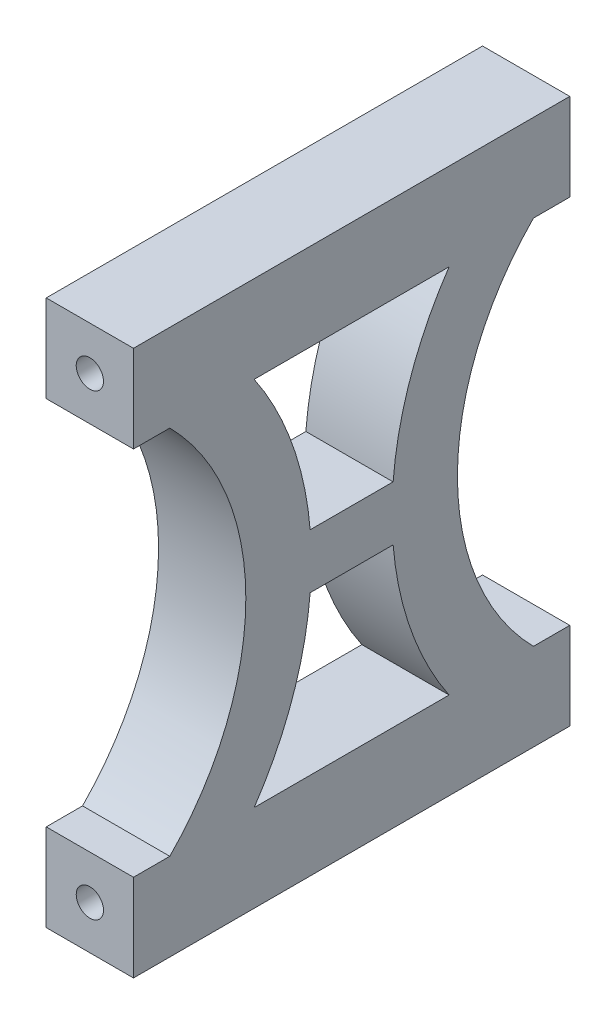
ISO-10303-21;
HEADER;
FILE_DESCRIPTION(('STEP AP214'),'2;1');
FILE_NAME('part.step','',(''),(''),'','','');
FILE_SCHEMA(('AUTOMOTIVE_DESIGN { 1 0 10303 214 1 1 1 1 }'));
ENDSEC;
DATA;
#1=APPLICATION_CONTEXT('core data for automotive mechanical design processes');
#2=APPLICATION_PROTOCOL_DEFINITION('international standard','automotive_design',2000,#1);
#3=PRODUCT_CONTEXT('',#1,'mechanical');
#4=PRODUCT('Part','Part','',(#3));
#5=PRODUCT_RELATED_PRODUCT_CATEGORY('part','',(#4));
#6=PRODUCT_DEFINITION_FORMATION('','',#4);
#7=PRODUCT_DEFINITION_CONTEXT('part definition',#1,'design');
#8=PRODUCT_DEFINITION('design','',#6,#7);
#9=PRODUCT_DEFINITION_SHAPE('','',#8);
#10=(LENGTH_UNIT() NAMED_UNIT(*) SI_UNIT(.MILLI.,.METRE.));
#11=(NAMED_UNIT(*) PLANE_ANGLE_UNIT() SI_UNIT($,.RADIAN.));
#12=(NAMED_UNIT(*) SI_UNIT($,.STERADIAN.) SOLID_ANGLE_UNIT());
#13=UNCERTAINTY_MEASURE_WITH_UNIT(LENGTH_MEASURE(1.E-05),#10,'distance_accuracy_value','');
#14=(GEOMETRIC_REPRESENTATION_CONTEXT(3) GLOBAL_UNCERTAINTY_ASSIGNED_CONTEXT((#13)) GLOBAL_UNIT_ASSIGNED_CONTEXT((#10,
#11,#12)) REPRESENTATION_CONTEXT('',''));
#15=CARTESIAN_POINT('',(0.,0.,0.));
#16=DIRECTION('',(0.,0.,1.));
#17=DIRECTION('',(1.,0.,0.));
#18=AXIS2_PLACEMENT_3D('',#15,#16,#17);
#19=CARTESIAN_POINT('',(-4.,17.,40.));
#20=DIRECTION('',(0.,1.,0.));
#21=DIRECTION('',(0.,0.,1.));
#22=AXIS2_PLACEMENT_3D('',#19,#20,#21);
#23=PLANE('',#22);
#24=DIRECTION('',(0.,0.,-1.));
#25=VECTOR('',#24,1.);
#26=CARTESIAN_POINT('',(4.,17.,40.));
#27=LINE('',#26,#25);
#28=CARTESIAN_POINT('',(4.,17.,3.32964050832425));
#29=VERTEX_POINT('',#28);
#30=CARTESIAN_POINT('',(4.,17.,0.));
#31=VERTEX_POINT('',#30);
#32=EDGE_CURVE('E292',#29,#31,#27,.T.);
#33=ORIENTED_EDGE('',*,*,#32,.F.);
#34=DIRECTION('',(-1.,0.,0.));
#35=VECTOR('',#34,1.);
#36=CARTESIAN_POINT('',(4.,17.,3.32964050832425));
#37=LINE('',#36,#35);
#38=CARTESIAN_POINT('',(-4.,17.,3.32964050832425));
#39=VERTEX_POINT('',#38);
#40=EDGE_CURVE('E249',#29,#39,#37,.T.);
#41=ORIENTED_EDGE('',*,*,#40,.T.);
#42=DIRECTION('',(0.,0.,-1.));
#43=VECTOR('',#42,1.);
#44=CARTESIAN_POINT('',(-4.,17.,40.));
#45=LINE('',#44,#43);
#46=CARTESIAN_POINT('',(-4.,17.,0.));
#47=VERTEX_POINT('',#46);
#48=EDGE_CURVE('E305',#39,#47,#45,.T.);
#49=ORIENTED_EDGE('',*,*,#48,.T.);
#50=DIRECTION('',(1.,0.,0.));
#51=VECTOR('',#50,1.);
#52=CARTESIAN_POINT('',(-4.,17.,0.));
#53=LINE('',#52,#51);
#54=EDGE_CURVE('E286',#47,#31,#53,.T.);
#55=ORIENTED_EDGE('',*,*,#54,.T.);
#56=EDGE_LOOP('',(#33,#41,#49,#55));
#57=FACE_BOUND('',#56,.T.);
#58=ADVANCED_FACE('F31',(#57),#23,.F.);
#59=CARTESIAN_POINT('',(-4.,17.,28.9360149786938));
#60=VERTEX_POINT('',#59);
#61=CARTESIAN_POINT('',(-4.,17.,11.0639850213062));
#62=VERTEX_POINT('',#61);
#63=EDGE_CURVE('E46',#60,#62,#45,.T.);
#64=ORIENTED_EDGE('',*,*,#63,.T.);
#65=DIRECTION('',(-1.,0.,0.));
#66=VECTOR('',#65,1.);
#67=CARTESIAN_POINT('',(4.,17.,11.0639850213062));
#68=LINE('',#67,#66);
#69=CARTESIAN_POINT('',(4.,17.,11.0639850213062));
#70=VERTEX_POINT('',#69);
#71=EDGE_CURVE('E253',#70,#62,#68,.T.);
#72=ORIENTED_EDGE('',*,*,#71,.F.);
#73=CARTESIAN_POINT('',(4.,17.,28.9360149786938));
#74=VERTEX_POINT('',#73);
#75=EDGE_CURVE('E306',#74,#70,#27,.T.);
#76=ORIENTED_EDGE('',*,*,#75,.F.);
#77=DIRECTION('',(-1.,0.,0.));
#78=VECTOR('',#77,1.);
#79=CARTESIAN_POINT('',(4.,17.,28.9360149786938));
#80=LINE('',#79,#78);
#81=EDGE_CURVE('E259',#74,#60,#80,.T.);
#82=ORIENTED_EDGE('',*,*,#81,.T.);
#83=EDGE_LOOP('',(#64,#72,#76,#82));
#84=FACE_BOUND('',#83,.T.);
#85=ADVANCED_FACE('F373',(#84),#23,.F.);
#86=CARTESIAN_POINT('',(4.,17.,40.));
#87=DIRECTION('',(0.,0.,1.));
#88=DIRECTION('',(1.,0.,0.));
#89=AXIS2_PLACEMENT_3D('',#86,#87,#88);
#90=PLANE('',#89);
#91=DIRECTION('',(0.,1.,0.));
#92=VECTOR('',#91,1.);
#93=CARTESIAN_POINT('',(4.,25.,40.));
#94=LINE('',#93,#92);
#95=CARTESIAN_POINT('',(4.,17.,40.));
#96=VERTEX_POINT('',#95);
#97=CARTESIAN_POINT('',(4.,25.,40.));
#98=VERTEX_POINT('',#97);
#99=EDGE_CURVE('E282',#96,#98,#94,.T.);
#100=ORIENTED_EDGE('',*,*,#99,.T.);
#101=DIRECTION('',(-1.,0.,0.));
#102=VECTOR('',#101,1.);
#103=CARTESIAN_POINT('',(-4.,25.,40.));
#104=LINE('',#103,#102);
#105=CARTESIAN_POINT('',(-4.,25.,40.));
#106=VERTEX_POINT('',#105);
#107=EDGE_CURVE('E285',#98,#106,#104,.T.);
#108=ORIENTED_EDGE('',*,*,#107,.T.);
#109=DIRECTION('',(0.,-1.,0.));
#110=VECTOR('',#109,1.);
#111=CARTESIAN_POINT('',(-4.,25.,40.));
#112=LINE('',#111,#110);
#113=CARTESIAN_POINT('',(-4.,17.,40.));
#114=VERTEX_POINT('',#113);
#115=EDGE_CURVE('E288',#106,#114,#112,.T.);
#116=ORIENTED_EDGE('',*,*,#115,.T.);
#117=DIRECTION('',(1.,0.,0.));
#118=VECTOR('',#117,1.);
#119=CARTESIAN_POINT('',(-4.,17.,40.));
#120=LINE('',#119,#118);
#121=EDGE_CURVE('E290',#114,#96,#120,.T.);
#122=ORIENTED_EDGE('',*,*,#121,.T.);
#123=EDGE_LOOP('',(#100,#108,#116,#122));
#124=FACE_BOUND('',#123,.T.);
#125=CARTESIAN_POINT('',(0.,21.,40.));
#126=DIRECTION('',(0.,0.,1.));
#127=DIRECTION('',(1.,0.,0.));
#128=AXIS2_PLACEMENT_3D('',#125,#126,#127);
#129=CIRCLE('',#128,1.25);
#130=CARTESIAN_POINT('',(1.25,21.,40.));
#131=VERTEX_POINT('',#130);
#132=EDGE_CURVE('E276',#131,#131,#129,.T.);
#133=ORIENTED_EDGE('',*,*,#132,.F.);
#134=EDGE_LOOP('',(#133));
#135=FACE_BOUND('',#134,.T.);
#136=ADVANCED_FACE('F354',(#124,#135),#90,.T.);
#137=CARTESIAN_POINT('',(4.,17.,0.));
#138=DIRECTION('',(0.,0.,1.));
#139=DIRECTION('',(1.,0.,0.));
#140=AXIS2_PLACEMENT_3D('',#137,#138,#139);
#141=PLANE('',#140);
#142=DIRECTION('',(0.,1.,0.));
#143=VECTOR('',#142,1.);
#144=CARTESIAN_POINT('',(4.,25.,0.));
#145=LINE('',#144,#143);
#146=CARTESIAN_POINT('',(4.,25.,0.));
#147=VERTEX_POINT('',#146);
#148=EDGE_CURVE('E279',#31,#147,#145,.T.);
#149=ORIENTED_EDGE('',*,*,#148,.F.);
#150=ORIENTED_EDGE('',*,*,#54,.F.);
#151=DIRECTION('',(0.,-1.,0.));
#152=VECTOR('',#151,1.);
#153=CARTESIAN_POINT('',(-4.,25.,0.));
#154=LINE('',#153,#152);
#155=CARTESIAN_POINT('',(-4.,25.,0.));
#156=VERTEX_POINT('',#155);
#157=EDGE_CURVE('E297',#156,#47,#154,.T.);
#158=ORIENTED_EDGE('',*,*,#157,.F.);
#159=DIRECTION('',(-1.,0.,0.));
#160=VECTOR('',#159,1.);
#161=CARTESIAN_POINT('',(-4.,25.,0.));
#162=LINE('',#161,#160);
#163=EDGE_CURVE('E295',#147,#156,#162,.T.);
#164=ORIENTED_EDGE('',*,*,#163,.F.);
#165=EDGE_LOOP('',(#149,#150,#158,#164));
#166=FACE_BOUND('',#165,.T.);
#167=CARTESIAN_POINT('',(0.,21.,0.));
#168=DIRECTION('',(0.,0.,1.));
#169=DIRECTION('',(1.,0.,0.));
#170=AXIS2_PLACEMENT_3D('',#167,#168,#169);
#171=CIRCLE('',#170,1.25);
#172=CARTESIAN_POINT('',(1.25,21.,0.));
#173=VERTEX_POINT('',#172);
#174=EDGE_CURVE('E252',#173,#173,#171,.T.);
#175=ORIENTED_EDGE('',*,*,#174,.T.);
#176=EDGE_LOOP('',(#175));
#177=FACE_BOUND('',#176,.T.);
#178=ADVANCED_FACE('F315',(#166,#177),#141,.F.);
#179=CARTESIAN_POINT('',(4.,25.,40.));
#180=DIRECTION('',(-1.,0.,0.));
#181=DIRECTION('',(0.,-1.,0.));
#182=AXIS2_PLACEMENT_3D('',#179,#180,#181);
#183=PLANE('',#182);
#184=CARTESIAN_POINT('',(4.,0.,53.9165540725057));
#185=DIRECTION('',(1.,0.,0.));
#186=DIRECTION('',(0.,-1.,0.));
#187=AXIS2_PLACEMENT_3D('',#184,#185,#186);
#188=CIRCLE('',#187,24.2163421581346);
#189=CARTESIAN_POINT('',(4.,-17.,36.6703594916758));
#190=VERTEX_POINT('',#189);
#191=CARTESIAN_POINT('',(4.,17.,36.6703594916758));
#192=VERTEX_POINT('',#191);
#193=EDGE_CURVE('E217',#190,#192,#188,.T.);
#194=ORIENTED_EDGE('',*,*,#193,.F.);
#195=DIRECTION('',(0.,0.,-1.));
#196=VECTOR('',#195,1.);
#197=CARTESIAN_POINT('',(4.,-17.,40.));
#198=LINE('',#197,#196);
#199=CARTESIAN_POINT('',(4.,-17.,40.));
#200=VERTEX_POINT('',#199);
#201=EDGE_CURVE('E201',#200,#190,#198,.T.);
#202=ORIENTED_EDGE('',*,*,#201,.F.);
#203=DIRECTION('',(0.,1.,0.));
#204=VECTOR('',#203,1.);
#205=CARTESIAN_POINT('',(4.,-25.,40.));
#206=LINE('',#205,#204);
#207=CARTESIAN_POINT('',(4.,-25.,40.));
#208=VERTEX_POINT('',#207);
#209=EDGE_CURVE('E179',#208,#200,#206,.T.);
#210=ORIENTED_EDGE('',*,*,#209,.F.);
#211=DIRECTION('',(0.,0.,-1.));
#212=VECTOR('',#211,1.);
#213=CARTESIAN_POINT('',(4.,-25.,40.));
#214=LINE('',#213,#212);
#215=CARTESIAN_POINT('',(4.,-25.,0.));
#216=VERTEX_POINT('',#215);
#217=EDGE_CURVE('E176',#208,#216,#214,.T.);
#218=ORIENTED_EDGE('',*,*,#217,.T.);
#219=DIRECTION('',(0.,1.,0.));
#220=VECTOR('',#219,1.);
#221=CARTESIAN_POINT('',(4.,-25.,0.));
#222=LINE('',#221,#220);
#223=CARTESIAN_POINT('',(4.,-17.,0.));
#224=VERTEX_POINT('',#223);
#225=EDGE_CURVE('E458',#216,#224,#222,.T.);
#226=ORIENTED_EDGE('',*,*,#225,.T.);
#227=CARTESIAN_POINT('',(4.00000000000001,-17.,3.32964050832425));
#228=VERTEX_POINT('',#227);
#229=EDGE_CURVE('E335',#228,#224,#198,.T.);
#230=ORIENTED_EDGE('',*,*,#229,.F.);
#231=CARTESIAN_POINT('',(4.,0.,-13.9165540725057));
#232=DIRECTION('',(1.,0.,0.));
#233=DIRECTION('',(0.,1.,0.));
#234=AXIS2_PLACEMENT_3D('',#231,#232,#233);
#235=CIRCLE('',#234,24.2163421581346);
#236=EDGE_CURVE('E205',#29,#228,#235,.T.);
#237=ORIENTED_EDGE('',*,*,#236,.F.);
#238=ORIENTED_EDGE('',*,*,#32,.T.);
#239=ORIENTED_EDGE('',*,*,#148,.T.);
#240=DIRECTION('',(0.,0.,-1.));
#241=VECTOR('',#240,1.);
#242=CARTESIAN_POINT('',(4.,25.,40.));
#243=LINE('',#242,#241);
#244=EDGE_CURVE('E11',#98,#147,#243,.T.);
#245=ORIENTED_EDGE('',*,*,#244,.F.);
#246=ORIENTED_EDGE('',*,*,#99,.F.);
#247=EDGE_CURVE('E302',#96,#192,#27,.T.);
#248=ORIENTED_EDGE('',*,*,#247,.T.);
#249=EDGE_LOOP('',(#194,#202,#210,#218,#226,#230,#237,#238,#239,#245,#246,#248));
#250=FACE_BOUND('',#249,.T.);
#251=CARTESIAN_POINT('',(4.,0.,53.9165540725057));
#252=DIRECTION('',(-1.,0.,0.));
#253=DIRECTION('',(0.,-1.,0.));
#254=AXIS2_PLACEMENT_3D('',#251,#252,#253);
#255=CIRCLE('',#254,30.2163421581346);
#256=CARTESIAN_POINT('',(4.,2.49108976294423,23.8030719555133));
#257=VERTEX_POINT('',#256);
#258=EDGE_CURVE('E220',#74,#257,#255,.T.);
#259=ORIENTED_EDGE('',*,*,#258,.F.);
#260=ORIENTED_EDGE('',*,*,#75,.T.);
#261=CARTESIAN_POINT('',(4.,0.,-13.9165540725057));
#262=DIRECTION('',(-1.,0.,0.));
#263=DIRECTION('',(0.,1.,0.));
#264=AXIS2_PLACEMENT_3D('',#261,#262,#263);
#265=CIRCLE('',#264,30.2163421581346);
#266=CARTESIAN_POINT('',(4.,2.49108976294424,16.1969280444867));
#267=VERTEX_POINT('',#266);
#268=EDGE_CURVE('E226',#267,#70,#265,.T.);
#269=ORIENTED_EDGE('',*,*,#268,.F.);
#270=DIRECTION('',(0.,0.,-1.));
#271=VECTOR('',#270,1.);
#272=CARTESIAN_POINT('',(4.,2.49108976294423,23.8030719555133));
#273=LINE('',#272,#271);
#274=EDGE_CURVE('E223',#257,#267,#273,.T.);
#275=ORIENTED_EDGE('',*,*,#274,.F.);
#276=EDGE_LOOP('',(#259,#260,#269,#275));
#277=FACE_BOUND('',#276,.T.);
#278=CARTESIAN_POINT('',(4.,-17.,28.9360149786938));
#279=VERTEX_POINT('',#278);
#280=CARTESIAN_POINT('',(4.,-17.,11.0639850213062));
#281=VERTEX_POINT('',#280);
#282=EDGE_CURVE('E337',#279,#281,#198,.T.);
#283=ORIENTED_EDGE('',*,*,#282,.F.);
#284=CARTESIAN_POINT('',(4.,0.,53.9165540725057));
#285=DIRECTION('',(-1.,0.,0.));
#286=DIRECTION('',(0.,-1.,0.));
#287=AXIS2_PLACEMENT_3D('',#284,#285,#286);
#288=CIRCLE('',#287,30.2163421581346);
#289=CARTESIAN_POINT('',(4.00000000000001,-2.50891023705574,23.8045514350214));
#290=VERTEX_POINT('',#289);
#291=EDGE_CURVE('E214',#290,#279,#288,.T.);
#292=ORIENTED_EDGE('',*,*,#291,.F.);
#293=DIRECTION('',(0.,0.,1.));
#294=VECTOR('',#293,1.);
#295=CARTESIAN_POINT('',(4.00000000000001,-2.50891023705577,23.8045514350214));
#296=LINE('',#295,#294);
#297=CARTESIAN_POINT('',(4.00000000000001,-2.50891023705577,16.1954485649786));
#298=VERTEX_POINT('',#297);
#299=EDGE_CURVE('E211',#298,#290,#296,.T.);
#300=ORIENTED_EDGE('',*,*,#299,.F.);
#301=CARTESIAN_POINT('',(4.,0.,-13.9165540725057));
#302=DIRECTION('',(-1.,0.,0.));
#303=DIRECTION('',(0.,1.,0.));
#304=AXIS2_PLACEMENT_3D('',#301,#302,#303);
#305=CIRCLE('',#304,30.2163421581346);
#306=EDGE_CURVE('E207',#281,#298,#305,.T.);
#307=ORIENTED_EDGE('',*,*,#306,.F.);
#308=EDGE_LOOP('',(#283,#292,#300,#307));
#309=FACE_BOUND('',#308,.T.);
#310=ADVANCED_FACE('F33',(#250,#277,#309),#183,.F.);
#311=CARTESIAN_POINT('',(-4.,25.,40.));
#312=DIRECTION('',(0.,-1.,0.));
#313=DIRECTION('',(0.,0.,-1.));
#314=AXIS2_PLACEMENT_3D('',#311,#312,#313);
#315=PLANE('',#314);
#316=ORIENTED_EDGE('',*,*,#163,.T.);
#317=DIRECTION('',(0.,0.,-1.));
#318=VECTOR('',#317,1.);
#319=CARTESIAN_POINT('',(-4.,25.,40.));
#320=LINE('',#319,#318);
#321=EDGE_CURVE('E39',#106,#156,#320,.T.);
#322=ORIENTED_EDGE('',*,*,#321,.F.);
#323=ORIENTED_EDGE('',*,*,#107,.F.);
#324=ORIENTED_EDGE('',*,*,#244,.T.);
#325=EDGE_LOOP('',(#316,#322,#323,#324));
#326=FACE_BOUND('',#325,.T.);
#327=ADVANCED_FACE('F356',(#326),#315,.F.);
#328=CARTESIAN_POINT('',(-4.,25.,40.));
#329=DIRECTION('',(1.,0.,0.));
#330=DIRECTION('',(0.,1.,0.));
#331=AXIS2_PLACEMENT_3D('',#328,#329,#330);
#332=PLANE('',#331);
#333=DIRECTION('',(0.,0.,-1.));
#334=VECTOR('',#333,1.);
#335=CARTESIAN_POINT('',(-4.,-17.,40.));
#336=LINE('',#335,#334);
#337=CARTESIAN_POINT('',(-4.,-17.,40.));
#338=VERTEX_POINT('',#337);
#339=CARTESIAN_POINT('',(-4.,-17.,36.6703594916758));
#340=VERTEX_POINT('',#339);
#341=EDGE_CURVE('E331',#338,#340,#336,.T.);
#342=ORIENTED_EDGE('',*,*,#341,.T.);
#343=CARTESIAN_POINT('',(-4.,0.,53.9165540725057));
#344=DIRECTION('',(1.,0.,0.));
#345=DIRECTION('',(0.,-1.,0.));
#346=AXIS2_PLACEMENT_3D('',#343,#344,#345);
#347=CIRCLE('',#346,24.2163421581346);
#348=CARTESIAN_POINT('',(-4.,17.,36.6703594916758));
#349=VERTEX_POINT('',#348);
#350=EDGE_CURVE('E238',#340,#349,#347,.T.);
#351=ORIENTED_EDGE('',*,*,#350,.T.);
#352=EDGE_CURVE('E54',#114,#349,#45,.T.);
#353=ORIENTED_EDGE('',*,*,#352,.F.);
#354=ORIENTED_EDGE('',*,*,#115,.F.);
#355=ORIENTED_EDGE('',*,*,#321,.T.);
#356=ORIENTED_EDGE('',*,*,#157,.T.);
#357=ORIENTED_EDGE('',*,*,#48,.F.);
#358=CARTESIAN_POINT('',(-4.,0.,-13.9165540725057));
#359=DIRECTION('',(1.,0.,0.));
#360=DIRECTION('',(0.,1.,0.));
#361=AXIS2_PLACEMENT_3D('',#358,#359,#360);
#362=CIRCLE('',#361,24.2163421581346);
#363=CARTESIAN_POINT('',(-3.99999999999999,-17.,3.32964050832425));
#364=VERTEX_POINT('',#363);
#365=EDGE_CURVE('E196',#39,#364,#362,.T.);
#366=ORIENTED_EDGE('',*,*,#365,.T.);
#367=CARTESIAN_POINT('',(-4.,-17.,0.));
#368=VERTEX_POINT('',#367);
#369=EDGE_CURVE('E321',#364,#368,#336,.T.);
#370=ORIENTED_EDGE('',*,*,#369,.T.);
#371=DIRECTION('',(0.,-1.,0.));
#372=VECTOR('',#371,1.);
#373=CARTESIAN_POINT('',(-4.,-25.,0.));
#374=LINE('',#373,#372);
#375=CARTESIAN_POINT('',(-4.,-25.,0.));
#376=VERTEX_POINT('',#375);
#377=EDGE_CURVE('E195',#368,#376,#374,.T.);
#378=ORIENTED_EDGE('',*,*,#377,.T.);
#379=DIRECTION('',(0.,0.,-1.));
#380=VECTOR('',#379,1.);
#381=CARTESIAN_POINT('',(-4.,-25.,40.));
#382=LINE('',#381,#380);
#383=CARTESIAN_POINT('',(-4.,-25.,40.));
#384=VERTEX_POINT('',#383);
#385=EDGE_CURVE('E173',#384,#376,#382,.T.);
#386=ORIENTED_EDGE('',*,*,#385,.F.);
#387=DIRECTION('',(0.,-1.,0.));
#388=VECTOR('',#387,1.);
#389=CARTESIAN_POINT('',(-4.,-25.,40.));
#390=LINE('',#389,#388);
#391=EDGE_CURVE('E180',#338,#384,#390,.T.);
#392=ORIENTED_EDGE('',*,*,#391,.F.);
#393=EDGE_LOOP('',(#342,#351,#353,#354,#355,#356,#357,#366,#370,#378,#386,#392));
#394=FACE_BOUND('',#393,.T.);
#395=ORIENTED_EDGE('',*,*,#63,.F.);
#396=CARTESIAN_POINT('',(-4.,0.,53.9165540725057));
#397=DIRECTION('',(-1.,0.,0.));
#398=DIRECTION('',(0.,-1.,0.));
#399=AXIS2_PLACEMENT_3D('',#396,#397,#398);
#400=CIRCLE('',#399,30.2163421581346);
#401=CARTESIAN_POINT('',(-4.,2.49108976294423,23.8030719555133));
#402=VERTEX_POINT('',#401);
#403=EDGE_CURVE('E241',#60,#402,#400,.T.);
#404=ORIENTED_EDGE('',*,*,#403,.T.);
#405=DIRECTION('',(0.,0.,-1.));
#406=VECTOR('',#405,1.);
#407=CARTESIAN_POINT('',(-4.,2.49108976294423,23.8030719555133));
#408=LINE('',#407,#406);
#409=CARTESIAN_POINT('',(-4.,2.49108976294423,16.1969280444867));
#410=VERTEX_POINT('',#409);
#411=EDGE_CURVE('E244',#402,#410,#408,.T.);
#412=ORIENTED_EDGE('',*,*,#411,.T.);
#413=CARTESIAN_POINT('',(-4.,0.,-13.9165540725057));
#414=DIRECTION('',(-1.,0.,0.));
#415=DIRECTION('',(0.,1.,0.));
#416=AXIS2_PLACEMENT_3D('',#413,#414,#415);
#417=CIRCLE('',#416,30.2163421581346);
#418=EDGE_CURVE('E208',#410,#62,#417,.T.);
#419=ORIENTED_EDGE('',*,*,#418,.T.);
#420=EDGE_LOOP('',(#395,#404,#412,#419));
#421=FACE_BOUND('',#420,.T.);
#422=CARTESIAN_POINT('',(-4.,0.,53.9165540725057));
#423=DIRECTION('',(-1.,0.,0.));
#424=DIRECTION('',(0.,-1.,0.));
#425=AXIS2_PLACEMENT_3D('',#422,#423,#424);
#426=CIRCLE('',#425,30.2163421581346);
#427=CARTESIAN_POINT('',(-3.99999999999999,-2.50891023705575,23.8045514350214));
#428=VERTEX_POINT('',#427);
#429=CARTESIAN_POINT('',(-3.99999999999999,-17.,28.9360149786938));
#430=VERTEX_POINT('',#429);
#431=EDGE_CURVE('E235',#428,#430,#426,.T.);
#432=ORIENTED_EDGE('',*,*,#431,.T.);
#433=CARTESIAN_POINT('',(-3.99999999999999,-17.,11.0639850213062));
#434=VERTEX_POINT('',#433);
#435=EDGE_CURVE('E329',#430,#434,#336,.T.);
#436=ORIENTED_EDGE('',*,*,#435,.T.);
#437=CARTESIAN_POINT('',(-4.,0.,-13.9165540725057));
#438=DIRECTION('',(-1.,0.,0.));
#439=DIRECTION('',(0.,1.,0.));
#440=AXIS2_PLACEMENT_3D('',#437,#438,#439);
#441=CIRCLE('',#440,30.2163421581346);
#442=CARTESIAN_POINT('',(-3.99999999999999,-2.50891023705577,16.1954485649786));
#443=VERTEX_POINT('',#442);
#444=EDGE_CURVE('E199',#434,#443,#441,.T.);
#445=ORIENTED_EDGE('',*,*,#444,.T.);
#446=DIRECTION('',(0.,0.,1.));
#447=VECTOR('',#446,1.);
#448=CARTESIAN_POINT('',(-3.99999999999999,-2.50891023705577,23.8045514350214));
#449=LINE('',#448,#447);
#450=EDGE_CURVE('E232',#443,#428,#449,.T.);
#451=ORIENTED_EDGE('',*,*,#450,.T.);
#452=EDGE_LOOP('',(#432,#436,#445,#451));
#453=FACE_BOUND('',#452,.T.);
#454=ADVANCED_FACE('F192',(#394,#421,#453),#332,.F.);
#455=ORIENTED_EDGE('',*,*,#352,.T.);
#456=DIRECTION('',(-1.,0.,0.));
#457=VECTOR('',#456,1.);
#458=CARTESIAN_POINT('',(4.,17.,36.6703594916757));
#459=LINE('',#458,#457);
#460=EDGE_CURVE('E261',#192,#349,#459,.T.);
#461=ORIENTED_EDGE('',*,*,#460,.F.);
#462=ORIENTED_EDGE('',*,*,#247,.F.);
#463=ORIENTED_EDGE('',*,*,#121,.F.);
#464=EDGE_LOOP('',(#455,#461,#462,#463));
#465=FACE_BOUND('',#464,.T.);
#466=ADVANCED_FACE('F352',(#465),#23,.F.);
#467=CARTESIAN_POINT('',(0.,21.,40.));
#468=DIRECTION('',(0.,0.,-1.));
#469=DIRECTION('',(-1.,0.,0.));
#470=AXIS2_PLACEMENT_3D('',#467,#468,#469);
#471=CYLINDRICAL_SURFACE('',#470,1.25);
#472=ORIENTED_EDGE('',*,*,#132,.T.);
#473=EDGE_LOOP('',(#472));
#474=FACE_BOUND('',#473,.T.);
#475=ORIENTED_EDGE('',*,*,#174,.F.);
#476=EDGE_LOOP('',(#475));
#477=FACE_BOUND('',#476,.T.);
#478=ADVANCED_FACE('F384',(#474,#477),#471,.F.);
#479=CARTESIAN_POINT('',(4.,0.,-13.9165540725057));
#480=DIRECTION('',(-1.,0.,0.));
#481=DIRECTION('',(0.,-1.,0.));
#482=AXIS2_PLACEMENT_3D('',#479,#480,#481);
#483=CYLINDRICAL_SURFACE('',#482,24.2163421581346);
#484=ORIENTED_EDGE('',*,*,#365,.F.);
#485=ORIENTED_EDGE('',*,*,#40,.F.);
#486=ORIENTED_EDGE('',*,*,#236,.T.);
#487=DIRECTION('',(-1.,0.,0.));
#488=VECTOR('',#487,1.);
#489=CARTESIAN_POINT('',(4.00000000000001,-17.,3.32964050832425));
#490=LINE('',#489,#488);
#491=EDGE_CURVE('E228',#228,#364,#490,.T.);
#492=ORIENTED_EDGE('',*,*,#491,.T.);
#493=EDGE_LOOP('',(#484,#485,#486,#492));
#494=FACE_BOUND('',#493,.T.);
#495=ADVANCED_FACE('F389',(#494),#483,.F.);
#496=CARTESIAN_POINT('',(4.,0.,-13.9165540725057));
#497=DIRECTION('',(-1.,0.,0.));
#498=DIRECTION('',(0.,-1.,0.));
#499=AXIS2_PLACEMENT_3D('',#496,#497,#498);
#500=CYLINDRICAL_SURFACE('',#499,30.2163421581346);
#501=ORIENTED_EDGE('',*,*,#418,.F.);
#502=DIRECTION('',(-1.,0.,0.));
#503=VECTOR('',#502,1.);
#504=CARTESIAN_POINT('',(4.,2.49108976294424,16.1969280444867));
#505=LINE('',#504,#503);
#506=EDGE_CURVE('E255',#267,#410,#505,.T.);
#507=ORIENTED_EDGE('',*,*,#506,.F.);
#508=ORIENTED_EDGE('',*,*,#268,.T.);
#509=ORIENTED_EDGE('',*,*,#71,.T.);
#510=EDGE_LOOP('',(#501,#507,#508,#509));
#511=FACE_BOUND('',#510,.T.);
#512=ADVANCED_FACE('F366',(#511),#500,.T.);
#513=CARTESIAN_POINT('',(4.,2.49108976294423,23.8030719555133));
#514=DIRECTION('',(0.,1.,0.));
#515=DIRECTION('',(-1.,0.,0.));
#516=AXIS2_PLACEMENT_3D('',#513,#514,#515);
#517=PLANE('',#516);
#518=ORIENTED_EDGE('',*,*,#411,.F.);
#519=DIRECTION('',(-1.,0.,0.));
#520=VECTOR('',#519,1.);
#521=CARTESIAN_POINT('',(4.,2.49108976294423,23.8030719555133));
#522=LINE('',#521,#520);
#523=EDGE_CURVE('E257',#257,#402,#522,.T.);
#524=ORIENTED_EDGE('',*,*,#523,.F.);
#525=ORIENTED_EDGE('',*,*,#274,.T.);
#526=ORIENTED_EDGE('',*,*,#506,.T.);
#527=EDGE_LOOP('',(#518,#524,#525,#526));
#528=FACE_BOUND('',#527,.T.);
#529=ADVANCED_FACE('F369',(#528),#517,.T.);
#530=CARTESIAN_POINT('',(4.,0.,53.9165540725057));
#531=DIRECTION('',(-1.,0.,0.));
#532=DIRECTION('',(0.,-1.,0.));
#533=AXIS2_PLACEMENT_3D('',#530,#531,#532);
#534=CYLINDRICAL_SURFACE('',#533,30.2163421581346);
#535=ORIENTED_EDGE('',*,*,#403,.F.);
#536=ORIENTED_EDGE('',*,*,#81,.F.);
#537=ORIENTED_EDGE('',*,*,#258,.T.);
#538=ORIENTED_EDGE('',*,*,#523,.T.);
#539=EDGE_LOOP('',(#535,#536,#537,#538));
#540=FACE_BOUND('',#539,.T.);
#541=ADVANCED_FACE('F372',(#540),#534,.T.);
#542=CARTESIAN_POINT('',(4.,0.,53.9165540725057));
#543=DIRECTION('',(-1.,0.,0.));
#544=DIRECTION('',(0.,-1.,0.));
#545=AXIS2_PLACEMENT_3D('',#542,#543,#544);
#546=CYLINDRICAL_SURFACE('',#545,24.2163421581346);
#547=ORIENTED_EDGE('',*,*,#350,.F.);
#548=DIRECTION('',(-1.,0.,0.));
#549=VECTOR('',#548,1.);
#550=CARTESIAN_POINT('',(4.00000000000001,-17.,36.6703594916758));
#551=LINE('',#550,#549);
#552=EDGE_CURVE('E263',#190,#340,#551,.T.);
#553=ORIENTED_EDGE('',*,*,#552,.F.);
#554=ORIENTED_EDGE('',*,*,#193,.T.);
#555=ORIENTED_EDGE('',*,*,#460,.T.);
#556=EDGE_LOOP('',(#547,#553,#554,#555));
#557=FACE_BOUND('',#556,.T.);
#558=ADVANCED_FACE('F347',(#557),#546,.F.);
#559=CARTESIAN_POINT('',(4.,0.,53.9165540725057));
#560=DIRECTION('',(-1.,0.,0.));
#561=DIRECTION('',(0.,-1.,0.));
#562=AXIS2_PLACEMENT_3D('',#559,#560,#561);
#563=CYLINDRICAL_SURFACE('',#562,30.2163421581346);
#564=ORIENTED_EDGE('',*,*,#431,.F.);
#565=DIRECTION('',(-1.,0.,0.));
#566=VECTOR('',#565,1.);
#567=CARTESIAN_POINT('',(4.00000000000001,-2.50891023705574,23.8045514350214));
#568=LINE('',#567,#566);
#569=EDGE_CURVE('E268',#290,#428,#568,.T.);
#570=ORIENTED_EDGE('',*,*,#569,.F.);
#571=ORIENTED_EDGE('',*,*,#291,.T.);
#572=DIRECTION('',(-1.,0.,0.));
#573=VECTOR('',#572,1.);
#574=CARTESIAN_POINT('',(4.00000000000001,-17.,28.9360149786938));
#575=LINE('',#574,#573);
#576=EDGE_CURVE('E265',#279,#430,#575,.T.);
#577=ORIENTED_EDGE('',*,*,#576,.T.);
#578=EDGE_LOOP('',(#564,#570,#571,#577));
#579=FACE_BOUND('',#578,.T.);
#580=ADVANCED_FACE('F413',(#579),#563,.T.);
#581=CARTESIAN_POINT('',(4.00000000000001,-2.50891023705577,23.8045514350214));
#582=DIRECTION('',(0.,-1.,0.));
#583=DIRECTION('',(1.,0.,0.));
#584=AXIS2_PLACEMENT_3D('',#581,#582,#583);
#585=PLANE('',#584);
#586=ORIENTED_EDGE('',*,*,#450,.F.);
#587=DIRECTION('',(-1.,0.,0.));
#588=VECTOR('',#587,1.);
#589=CARTESIAN_POINT('',(4.00000000000001,-2.50891023705577,16.1954485649786));
#590=LINE('',#589,#588);
#591=EDGE_CURVE('E270',#298,#443,#590,.T.);
#592=ORIENTED_EDGE('',*,*,#591,.F.);
#593=ORIENTED_EDGE('',*,*,#299,.T.);
#594=ORIENTED_EDGE('',*,*,#569,.T.);
#595=EDGE_LOOP('',(#586,#592,#593,#594));
#596=FACE_BOUND('',#595,.T.);
#597=ADVANCED_FACE('F409',(#596),#585,.T.);
#598=CARTESIAN_POINT('',(4.,0.,-13.9165540725057));
#599=DIRECTION('',(-1.,0.,0.));
#600=DIRECTION('',(0.,-1.,0.));
#601=AXIS2_PLACEMENT_3D('',#598,#599,#600);
#602=CYLINDRICAL_SURFACE('',#601,30.2163421581346);
#603=ORIENTED_EDGE('',*,*,#444,.F.);
#604=DIRECTION('',(-1.,0.,0.));
#605=VECTOR('',#604,1.);
#606=CARTESIAN_POINT('',(4.00000000000001,-17.,11.0639850213062));
#607=LINE('',#606,#605);
#608=EDGE_CURVE('E272',#281,#434,#607,.T.);
#609=ORIENTED_EDGE('',*,*,#608,.F.);
#610=ORIENTED_EDGE('',*,*,#306,.T.);
#611=ORIENTED_EDGE('',*,*,#591,.T.);
#612=EDGE_LOOP('',(#603,#609,#610,#611));
#613=FACE_BOUND('',#612,.T.);
#614=ADVANCED_FACE('F406',(#613),#602,.T.);
#615=CARTESIAN_POINT('',(-4.,-17.,40.));
#616=DIRECTION('',(0.,-1.,0.));
#617=DIRECTION('',(0.,0.,-1.));
#618=AXIS2_PLACEMENT_3D('',#615,#616,#617);
#619=PLANE('',#618);
#620=ORIENTED_EDGE('',*,*,#552,.T.);
#621=ORIENTED_EDGE('',*,*,#341,.F.);
#622=DIRECTION('',(-1.,0.,0.));
#623=VECTOR('',#622,1.);
#624=CARTESIAN_POINT('',(-4.,-17.,40.));
#625=LINE('',#624,#623);
#626=EDGE_CURVE('E186',#200,#338,#625,.T.);
#627=ORIENTED_EDGE('',*,*,#626,.F.);
#628=ORIENTED_EDGE('',*,*,#201,.T.);
#629=EDGE_LOOP('',(#620,#621,#627,#628));
#630=FACE_BOUND('',#629,.T.);
#631=ADVANCED_FACE('F343',(#630),#619,.F.);
#632=ORIENTED_EDGE('',*,*,#491,.F.);
#633=ORIENTED_EDGE('',*,*,#229,.T.);
#634=DIRECTION('',(-1.,0.,0.));
#635=VECTOR('',#634,1.);
#636=CARTESIAN_POINT('',(-4.,-17.,0.));
#637=LINE('',#636,#635);
#638=EDGE_CURVE('E190',#224,#368,#637,.T.);
#639=ORIENTED_EDGE('',*,*,#638,.T.);
#640=ORIENTED_EDGE('',*,*,#369,.F.);
#641=EDGE_LOOP('',(#632,#633,#639,#640));
#642=FACE_BOUND('',#641,.T.);
#643=ADVANCED_FACE('F326',(#642),#619,.F.);
#644=CARTESIAN_POINT('',(-4.,-17.,40.));
#645=DIRECTION('',(0.,0.,-1.));
#646=DIRECTION('',(-1.,0.,0.));
#647=AXIS2_PLACEMENT_3D('',#644,#645,#646);
#648=PLANE('',#647);
#649=ORIENTED_EDGE('',*,*,#391,.T.);
#650=DIRECTION('',(1.,0.,0.));
#651=VECTOR('',#650,1.);
#652=CARTESIAN_POINT('',(-4.,-25.,40.));
#653=LINE('',#652,#651);
#654=EDGE_CURVE('E169',#384,#208,#653,.T.);
#655=ORIENTED_EDGE('',*,*,#654,.T.);
#656=ORIENTED_EDGE('',*,*,#209,.T.);
#657=ORIENTED_EDGE('',*,*,#626,.T.);
#658=EDGE_LOOP('',(#649,#655,#656,#657));
#659=FACE_BOUND('',#658,.T.);
#660=CARTESIAN_POINT('',(0.,-21.,40.));
#661=DIRECTION('',(0.,0.,1.));
#662=DIRECTION('',(-1.,0.,0.));
#663=AXIS2_PLACEMENT_3D('',#660,#661,#662);
#664=CIRCLE('',#663,1.25);
#665=CARTESIAN_POINT('',(-1.25,-21.,40.));
#666=VERTEX_POINT('',#665);
#667=EDGE_CURVE('E446',#666,#666,#664,.T.);
#668=ORIENTED_EDGE('',*,*,#667,.F.);
#669=EDGE_LOOP('',(#668));
#670=FACE_BOUND('',#669,.T.);
#671=ADVANCED_FACE('F183',(#659,#670),#648,.F.);
#672=CARTESIAN_POINT('',(-4.,-17.,0.));
#673=DIRECTION('',(0.,0.,-1.));
#674=DIRECTION('',(-1.,0.,0.));
#675=AXIS2_PLACEMENT_3D('',#672,#673,#674);
#676=PLANE('',#675);
#677=ORIENTED_EDGE('',*,*,#377,.F.);
#678=ORIENTED_EDGE('',*,*,#638,.F.);
#679=ORIENTED_EDGE('',*,*,#225,.F.);
#680=DIRECTION('',(1.,0.,0.));
#681=VECTOR('',#680,1.);
#682=CARTESIAN_POINT('',(-4.,-25.,0.));
#683=LINE('',#682,#681);
#684=EDGE_CURVE('E456',#376,#216,#683,.T.);
#685=ORIENTED_EDGE('',*,*,#684,.F.);
#686=EDGE_LOOP('',(#677,#678,#679,#685));
#687=FACE_BOUND('',#686,.T.);
#688=CARTESIAN_POINT('',(0.,-21.,0.));
#689=DIRECTION('',(0.,0.,1.));
#690=DIRECTION('',(-1.,0.,0.));
#691=AXIS2_PLACEMENT_3D('',#688,#689,#690);
#692=CIRCLE('',#691,1.25);
#693=CARTESIAN_POINT('',(-1.25,-21.,0.));
#694=VERTEX_POINT('',#693);
#695=EDGE_CURVE('E449',#694,#694,#692,.T.);
#696=ORIENTED_EDGE('',*,*,#695,.T.);
#697=EDGE_LOOP('',(#696));
#698=FACE_BOUND('',#697,.T.);
#699=ADVANCED_FACE('F429',(#687,#698),#676,.T.);
#700=CARTESIAN_POINT('',(-4.,-25.,40.));
#701=DIRECTION('',(0.,1.,0.));
#702=DIRECTION('',(0.,0.,1.));
#703=AXIS2_PLACEMENT_3D('',#700,#701,#702);
#704=PLANE('',#703);
#705=ORIENTED_EDGE('',*,*,#684,.T.);
#706=ORIENTED_EDGE('',*,*,#217,.F.);
#707=ORIENTED_EDGE('',*,*,#654,.F.);
#708=ORIENTED_EDGE('',*,*,#385,.T.);
#709=EDGE_LOOP('',(#705,#706,#707,#708));
#710=FACE_BOUND('',#709,.T.);
#711=ADVANCED_FACE('F171',(#710),#704,.F.);
#712=ORIENTED_EDGE('',*,*,#576,.F.);
#713=ORIENTED_EDGE('',*,*,#282,.T.);
#714=ORIENTED_EDGE('',*,*,#608,.T.);
#715=ORIENTED_EDGE('',*,*,#435,.F.);
#716=EDGE_LOOP('',(#712,#713,#714,#715));
#717=FACE_BOUND('',#716,.T.);
#718=ADVANCED_FACE('F428',(#717),#619,.F.);
#719=CARTESIAN_POINT('',(0.,-21.,40.));
#720=DIRECTION('',(0.,0.,-1.));
#721=DIRECTION('',(-1.,0.,0.));
#722=AXIS2_PLACEMENT_3D('',#719,#720,#721);
#723=CYLINDRICAL_SURFACE('',#722,1.25);
#724=ORIENTED_EDGE('',*,*,#667,.T.);
#725=EDGE_LOOP('',(#724));
#726=FACE_BOUND('',#725,.T.);
#727=ORIENTED_EDGE('',*,*,#695,.F.);
#728=EDGE_LOOP('',(#727));
#729=FACE_BOUND('',#728,.T.);
#730=ADVANCED_FACE('F432',(#726,#729),#723,.F.);
#731=CLOSED_SHELL('',(#58,#85,#136,#178,#310,#327,#454,#466,#478,#495,#512,#529,#541,#558,#580,
#597,#614,#631,#643,#671,#699,#711,#718,#730));
#732=MANIFOLD_SOLID_BREP('B2',#731);
#733=ADVANCED_BREP_SHAPE_REPRESENTATION('',(#18,#732),#14);
#734=SHAPE_DEFINITION_REPRESENTATION(#9,#733);
ENDSEC;
END-ISO-10303-21;
